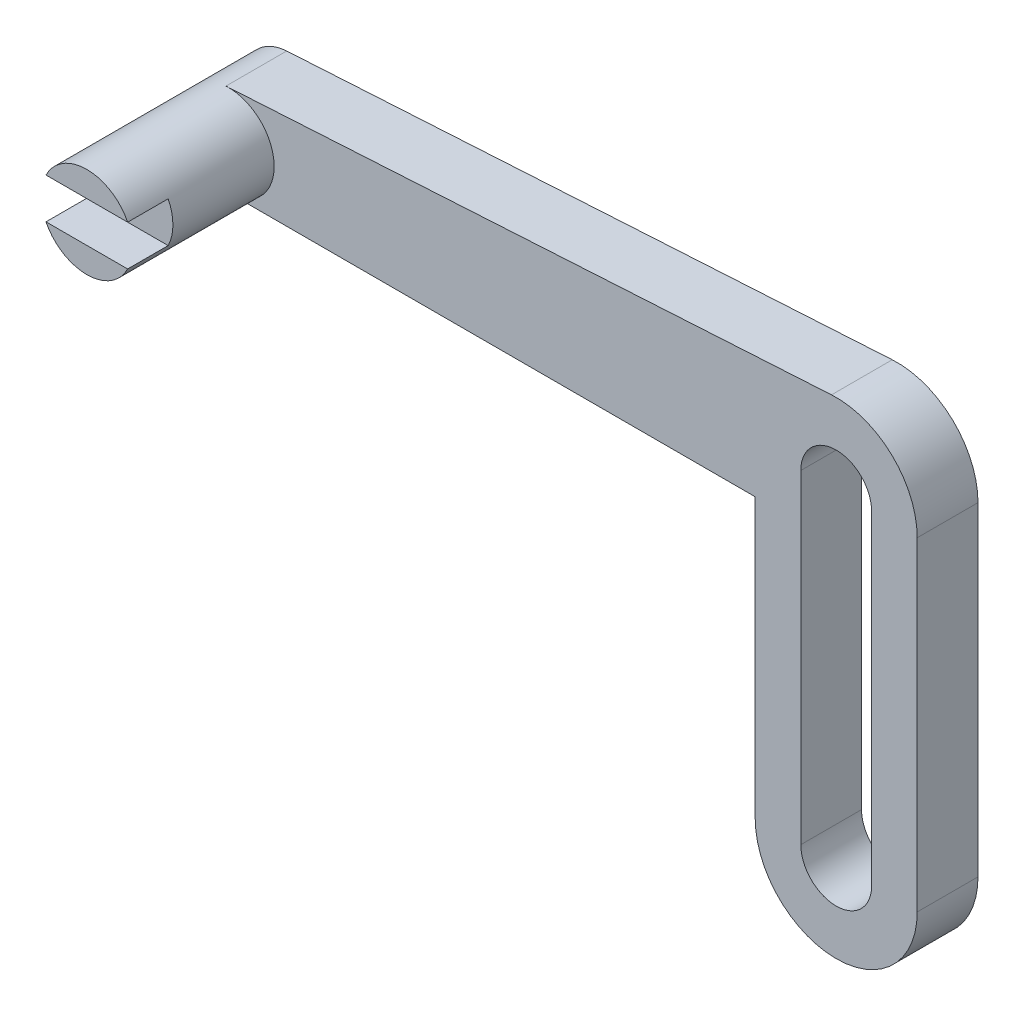
ISO-10303-21;
HEADER;
FILE_DESCRIPTION(('STEP AP214'),'2;1');
FILE_NAME('part.step','',(''),(''),'','','');
FILE_SCHEMA(('AUTOMOTIVE_DESIGN { 1 0 10303 214 1 1 1 1 }'));
ENDSEC;
DATA;
#1=APPLICATION_CONTEXT('core data for automotive mechanical design processes');
#2=APPLICATION_PROTOCOL_DEFINITION('international standard','automotive_design',2000,#1);
#3=PRODUCT_CONTEXT('',#1,'mechanical');
#4=PRODUCT('Part','Part','',(#3));
#5=PRODUCT_RELATED_PRODUCT_CATEGORY('part','',(#4));
#6=PRODUCT_DEFINITION_FORMATION('','',#4);
#7=PRODUCT_DEFINITION_CONTEXT('part definition',#1,'design');
#8=PRODUCT_DEFINITION('design','',#6,#7);
#9=PRODUCT_DEFINITION_SHAPE('','',#8);
#10=(LENGTH_UNIT() NAMED_UNIT(*) SI_UNIT(.MILLI.,.METRE.));
#11=(NAMED_UNIT(*) PLANE_ANGLE_UNIT() SI_UNIT($,.RADIAN.));
#12=(NAMED_UNIT(*) SI_UNIT($,.STERADIAN.) SOLID_ANGLE_UNIT());
#13=UNCERTAINTY_MEASURE_WITH_UNIT(LENGTH_MEASURE(1.E-05),#10,'distance_accuracy_value','');
#14=(GEOMETRIC_REPRESENTATION_CONTEXT(3) GLOBAL_UNCERTAINTY_ASSIGNED_CONTEXT((#13)) GLOBAL_UNIT_ASSIGNED_CONTEXT((#10,
#11,#12)) REPRESENTATION_CONTEXT('',''));
#15=CARTESIAN_POINT('',(0.,0.,0.));
#16=DIRECTION('',(0.,0.,1.));
#17=DIRECTION('',(1.,0.,0.));
#18=AXIS2_PLACEMENT_3D('',#15,#16,#17);
#19=CARTESIAN_POINT('',(0.,0.,10.));
#20=DIRECTION('',(0.,0.,1.));
#21=DIRECTION('',(1.,0.,0.));
#22=AXIS2_PLACEMENT_3D('',#19,#20,#21);
#23=PLANE('',#22);
#24=DIRECTION('',(-1.,0.,0.));
#25=VECTOR('',#24,1.);
#26=CARTESIAN_POINT('',(0.,1.,10.));
#27=LINE('',#26,#25);
#28=CARTESIAN_POINT('',(2.01556443707464,1.,10.));
#29=VERTEX_POINT('',#28);
#30=CARTESIAN_POINT('',(-2.01556443707464,1.,10.));
#31=VERTEX_POINT('',#30);
#32=EDGE_CURVE('E162',#29,#31,#27,.T.);
#33=ORIENTED_EDGE('',*,*,#32,.F.);
#34=CARTESIAN_POINT('',(0.,0.,10.));
#35=DIRECTION('',(0.,0.,1.));
#36=DIRECTION('',(1.,0.,0.));
#37=AXIS2_PLACEMENT_3D('',#34,#35,#36);
#38=CIRCLE('',#37,2.25);
#39=EDGE_CURVE('E176',#29,#31,#38,.T.);
#40=ORIENTED_EDGE('',*,*,#39,.T.);
#41=EDGE_LOOP('',(#33,#40));
#42=FACE_BOUND('',#41,.T.);
#43=ADVANCED_FACE('F41',(#42),#23,.T.);
#44=CARTESIAN_POINT('',(0.,0.,3.));
#45=DIRECTION('',(0.,0.,-1.));
#46=DIRECTION('',(-1.,0.,0.));
#47=AXIS2_PLACEMENT_3D('',#44,#45,#46);
#48=CYLINDRICAL_SURFACE('',#47,2.25);
#49=ORIENTED_EDGE('',*,*,#39,.F.);
#50=DIRECTION('',(0.,0.,-1.));
#51=VECTOR('',#50,1.);
#52=CARTESIAN_POINT('',(2.01556443707464,1.,3.));
#53=LINE('',#52,#51);
#54=CARTESIAN_POINT('',(2.01556443707464,1.,8.));
#55=VERTEX_POINT('',#54);
#56=EDGE_CURVE('E177',#29,#55,#53,.T.);
#57=ORIENTED_EDGE('',*,*,#56,.T.);
#58=CARTESIAN_POINT('',(0.,0.,8.));
#59=DIRECTION('',(0.,0.,-1.));
#60=DIRECTION('',(-1.,0.,0.));
#61=AXIS2_PLACEMENT_3D('',#58,#59,#60);
#62=CIRCLE('',#61,2.25);
#63=CARTESIAN_POINT('',(2.01556443707464,-1.,8.));
#64=VERTEX_POINT('',#63);
#65=EDGE_CURVE('E172',#55,#64,#62,.T.);
#66=ORIENTED_EDGE('',*,*,#65,.T.);
#67=DIRECTION('',(0.,0.,-1.));
#68=VECTOR('',#67,1.);
#69=CARTESIAN_POINT('',(2.01556443707464,-1.,3.));
#70=LINE('',#69,#68);
#71=CARTESIAN_POINT('',(2.01556443707464,-1.,10.));
#72=VERTEX_POINT('',#71);
#73=EDGE_CURVE('E155',#64,#72,#70,.F.);
#74=ORIENTED_EDGE('',*,*,#73,.T.);
#75=CARTESIAN_POINT('',(-2.01556443707464,-1.,10.));
#76=VERTEX_POINT('',#75);
#77=EDGE_CURVE('E170',#76,#72,#38,.T.);
#78=ORIENTED_EDGE('',*,*,#77,.F.);
#79=DIRECTION('',(0.,0.,-1.));
#80=VECTOR('',#79,1.);
#81=CARTESIAN_POINT('',(-2.01556443707464,-1.,3.));
#82=LINE('',#81,#80);
#83=CARTESIAN_POINT('',(-2.01556443707464,-1.,8.));
#84=VERTEX_POINT('',#83);
#85=EDGE_CURVE('E158',#76,#84,#82,.T.);
#86=ORIENTED_EDGE('',*,*,#85,.T.);
#87=CARTESIAN_POINT('',(-2.01556443707464,1.,8.));
#88=VERTEX_POINT('',#87);
#89=EDGE_CURVE('E259',#84,#88,#62,.T.);
#90=ORIENTED_EDGE('',*,*,#89,.T.);
#91=DIRECTION('',(0.,0.,-1.));
#92=VECTOR('',#91,1.);
#93=CARTESIAN_POINT('',(-2.01556443707464,1.,3.));
#94=LINE('',#93,#92);
#95=EDGE_CURVE('E181',#88,#31,#94,.F.);
#96=ORIENTED_EDGE('',*,*,#95,.T.);
#97=EDGE_LOOP('',(#49,#57,#66,#74,#78,#86,#90,#96));
#98=FACE_BOUND('',#97,.T.);
#99=CARTESIAN_POINT('',(0.,0.,0.));
#100=DIRECTION('',(0.,0.,1.));
#101=DIRECTION('',(1.,0.,0.));
#102=AXIS2_PLACEMENT_3D('',#99,#100,#101);
#103=CIRCLE('',#102,2.25);
#104=CARTESIAN_POINT('',(-0.13125,2.24616861288283,0.));
#105=VERTEX_POINT('',#104);
#106=CARTESIAN_POINT('',(0.,-2.25,0.));
#107=VERTEX_POINT('',#106);
#108=EDGE_CURVE('E224',#105,#107,#103,.T.);
#109=ORIENTED_EDGE('',*,*,#108,.T.);
#110=DIRECTION('',(0.,0.,-1.));
#111=VECTOR('',#110,1.);
#112=CARTESIAN_POINT('',(0.,-2.25,3.));
#113=LINE('',#112,#111);
#114=CARTESIAN_POINT('',(0.,-2.25,3.));
#115=VERTEX_POINT('',#114);
#116=EDGE_CURVE('E163',#115,#107,#113,.T.);
#117=ORIENTED_EDGE('',*,*,#116,.F.);
#118=CARTESIAN_POINT('',(0.,0.,3.));
#119=DIRECTION('',(0.,0.,1.));
#120=DIRECTION('',(1.,0.,0.));
#121=AXIS2_PLACEMENT_3D('',#118,#119,#120);
#122=CIRCLE('',#121,2.25);
#123=CARTESIAN_POINT('',(-0.13125,2.24616861288284,3.));
#124=VERTEX_POINT('',#123);
#125=EDGE_CURVE('E180',#124,#115,#122,.F.);
#126=ORIENTED_EDGE('',*,*,#125,.F.);
#127=DIRECTION('',(0.,0.,-1.));
#128=VECTOR('',#127,1.);
#129=CARTESIAN_POINT('',(-0.13125,2.24616861288283,3.));
#130=LINE('',#129,#128);
#131=EDGE_CURVE('E240',#124,#105,#130,.T.);
#132=ORIENTED_EDGE('',*,*,#131,.T.);
#133=EDGE_LOOP('',(#109,#117,#126,#132));
#134=FACE_BOUND('',#133,.T.);
#135=ADVANCED_FACE('F168',(#98,#134),#48,.T.);
#136=CARTESIAN_POINT('',(0.,-2.25,3.));
#137=DIRECTION('',(0.,1.,0.));
#138=DIRECTION('',(-1.,0.,0.));
#139=AXIS2_PLACEMENT_3D('',#136,#137,#138);
#140=PLANE('',#139);
#141=DIRECTION('',(1.,0.,0.));
#142=VECTOR('',#141,1.);
#143=CARTESIAN_POINT('',(0.,-2.25,0.));
#144=LINE('',#143,#142);
#145=CARTESIAN_POINT('',(26.,-2.25,0.));
#146=VERTEX_POINT('',#145);
#147=EDGE_CURVE('E227',#107,#146,#144,.T.);
#148=ORIENTED_EDGE('',*,*,#147,.T.);
#149=DIRECTION('',(0.,0.,-1.));
#150=VECTOR('',#149,1.);
#151=CARTESIAN_POINT('',(26.,-2.25,3.));
#152=LINE('',#151,#150);
#153=CARTESIAN_POINT('',(26.,-2.25,3.));
#154=VERTEX_POINT('',#153);
#155=EDGE_CURVE('E247',#154,#146,#152,.T.);
#156=ORIENTED_EDGE('',*,*,#155,.F.);
#157=DIRECTION('',(1.,0.,0.));
#158=VECTOR('',#157,1.);
#159=CARTESIAN_POINT('',(0.,-2.25,3.));
#160=LINE('',#159,#158);
#161=EDGE_CURVE('E200',#115,#154,#160,.T.);
#162=ORIENTED_EDGE('',*,*,#161,.F.);
#163=ORIENTED_EDGE('',*,*,#116,.T.);
#164=EDGE_LOOP('',(#148,#156,#162,#163));
#165=FACE_BOUND('',#164,.T.);
#166=ADVANCED_FACE('F282',(#165),#140,.F.);
#167=CARTESIAN_POINT('',(26.,0.,3.));
#168=DIRECTION('',(-1.,0.,0.));
#169=DIRECTION('',(0.,0.,1.));
#170=AXIS2_PLACEMENT_3D('',#167,#168,#169);
#171=PLANE('',#170);
#172=DIRECTION('',(0.,1.,0.));
#173=VECTOR('',#172,1.);
#174=CARTESIAN_POINT('',(26.,0.,0.));
#175=LINE('',#174,#173);
#176=CARTESIAN_POINT('',(26.,-16.,0.));
#177=VERTEX_POINT('',#176);
#178=EDGE_CURVE('E230',#177,#146,#175,.T.);
#179=ORIENTED_EDGE('',*,*,#178,.F.);
#180=DIRECTION('',(0.,0.,-1.));
#181=VECTOR('',#180,1.);
#182=CARTESIAN_POINT('',(26.,-16.,3.));
#183=LINE('',#182,#181);
#184=CARTESIAN_POINT('',(26.,-16.,3.));
#185=VERTEX_POINT('',#184);
#186=EDGE_CURVE('E266',#177,#185,#183,.F.);
#187=ORIENTED_EDGE('',*,*,#186,.T.);
#188=DIRECTION('',(0.,1.,0.));
#189=VECTOR('',#188,1.);
#190=CARTESIAN_POINT('',(26.,0.,3.));
#191=LINE('',#190,#189);
#192=EDGE_CURVE('E203',#185,#154,#191,.T.);
#193=ORIENTED_EDGE('',*,*,#192,.T.);
#194=ORIENTED_EDGE('',*,*,#155,.T.);
#195=EDGE_LOOP('',(#179,#187,#193,#194));
#196=FACE_BOUND('',#195,.T.);
#197=ADVANCED_FACE('F273',(#196),#171,.T.);
#198=CARTESIAN_POINT('',(34.,0.,3.));
#199=DIRECTION('',(1.,0.,0.));
#200=DIRECTION('',(0.,1.,0.));
#201=AXIS2_PLACEMENT_3D('',#198,#199,#200);
#202=PLANE('',#201);
#203=DIRECTION('',(0.,-1.,0.));
#204=VECTOR('',#203,1.);
#205=CARTESIAN_POINT('',(34.,0.,3.));
#206=LINE('',#205,#204);
#207=CARTESIAN_POINT('',(34.,0.,3.));
#208=VERTEX_POINT('',#207);
#209=CARTESIAN_POINT('',(34.,-16.,3.));
#210=VERTEX_POINT('',#209);
#211=EDGE_CURVE('E205',#208,#210,#206,.T.);
#212=ORIENTED_EDGE('',*,*,#211,.T.);
#213=DIRECTION('',(0.,0.,-1.));
#214=VECTOR('',#213,1.);
#215=CARTESIAN_POINT('',(34.,-16.,3.));
#216=LINE('',#215,#214);
#217=CARTESIAN_POINT('',(34.,-16.,0.));
#218=VERTEX_POINT('',#217);
#219=EDGE_CURVE('E11',#210,#218,#216,.T.);
#220=ORIENTED_EDGE('',*,*,#219,.T.);
#221=DIRECTION('',(0.,-1.,0.));
#222=VECTOR('',#221,1.);
#223=CARTESIAN_POINT('',(34.,0.,0.));
#224=LINE('',#223,#222);
#225=CARTESIAN_POINT('',(34.,0.,0.));
#226=VERTEX_POINT('',#225);
#227=EDGE_CURVE('E232',#226,#218,#224,.T.);
#228=ORIENTED_EDGE('',*,*,#227,.F.);
#229=DIRECTION('',(0.,0.,-1.));
#230=VECTOR('',#229,1.);
#231=CARTESIAN_POINT('',(34.,0.,3.));
#232=LINE('',#231,#230);
#233=EDGE_CURVE('E245',#208,#226,#232,.T.);
#234=ORIENTED_EDGE('',*,*,#233,.F.);
#235=EDGE_LOOP('',(#212,#220,#228,#234));
#236=FACE_BOUND('',#235,.T.);
#237=ADVANCED_FACE('F335',(#236),#202,.T.);
#238=CARTESIAN_POINT('',(30.,0.,3.));
#239=DIRECTION('',(0.,0.,-1.));
#240=DIRECTION('',(-1.,0.,0.));
#241=AXIS2_PLACEMENT_3D('',#238,#239,#240);
#242=CYLINDRICAL_SURFACE('',#241,4.);
#243=CARTESIAN_POINT('',(30.,0.,0.));
#244=DIRECTION('',(0.,0.,1.));
#245=DIRECTION('',(1.,0.,0.));
#246=AXIS2_PLACEMENT_3D('',#243,#244,#245);
#247=CIRCLE('',#246,4.);
#248=CARTESIAN_POINT('',(29.7666666666667,3.99318864512504,0.));
#249=VERTEX_POINT('',#248);
#250=EDGE_CURVE('E235',#226,#249,#247,.T.);
#251=ORIENTED_EDGE('',*,*,#250,.T.);
#252=DIRECTION('',(0.,0.,-1.));
#253=VECTOR('',#252,1.);
#254=CARTESIAN_POINT('',(29.7666666666667,3.99318864512504,3.));
#255=LINE('',#254,#253);
#256=CARTESIAN_POINT('',(29.7666666666667,3.99318864512504,3.));
#257=VERTEX_POINT('',#256);
#258=EDGE_CURVE('E242',#257,#249,#255,.T.);
#259=ORIENTED_EDGE('',*,*,#258,.F.);
#260=CARTESIAN_POINT('',(30.,0.,3.));
#261=DIRECTION('',(0.,0.,1.));
#262=DIRECTION('',(1.,0.,0.));
#263=AXIS2_PLACEMENT_3D('',#260,#261,#262);
#264=CIRCLE('',#263,4.);
#265=EDGE_CURVE('E207',#208,#257,#264,.T.);
#266=ORIENTED_EDGE('',*,*,#265,.F.);
#267=ORIENTED_EDGE('',*,*,#233,.T.);
#268=EDGE_LOOP('',(#251,#259,#266,#267));
#269=FACE_BOUND('',#268,.T.);
#270=ADVANCED_FACE('F331',(#269),#242,.T.);
#271=CARTESIAN_POINT('',(28.25,0.,3.));
#272=DIRECTION('',(1.,0.,0.));
#273=DIRECTION('',(0.,1.,0.));
#274=AXIS2_PLACEMENT_3D('',#271,#272,#273);
#275=PLANE('',#274);
#276=DIRECTION('',(0.,-1.,0.));
#277=VECTOR('',#276,1.);
#278=CARTESIAN_POINT('',(28.25,0.,0.));
#279=LINE('',#278,#277);
#280=CARTESIAN_POINT('',(28.25,0.,0.));
#281=VERTEX_POINT('',#280);
#282=CARTESIAN_POINT('',(28.25,-16.,0.));
#283=VERTEX_POINT('',#282);
#284=EDGE_CURVE('E186',#281,#283,#279,.T.);
#285=ORIENTED_EDGE('',*,*,#284,.F.);
#286=DIRECTION('',(0.,0.,-1.));
#287=VECTOR('',#286,1.);
#288=CARTESIAN_POINT('',(28.25,0.,3.));
#289=LINE('',#288,#287);
#290=CARTESIAN_POINT('',(28.25,0.,3.));
#291=VERTEX_POINT('',#290);
#292=EDGE_CURVE('E243',#291,#281,#289,.T.);
#293=ORIENTED_EDGE('',*,*,#292,.F.);
#294=DIRECTION('',(0.,-1.,0.));
#295=VECTOR('',#294,1.);
#296=CARTESIAN_POINT('',(28.25,0.,3.));
#297=LINE('',#296,#295);
#298=CARTESIAN_POINT('',(28.25,-16.,3.));
#299=VERTEX_POINT('',#298);
#300=EDGE_CURVE('E187',#291,#299,#297,.T.);
#301=ORIENTED_EDGE('',*,*,#300,.T.);
#302=DIRECTION('',(0.,0.,-1.));
#303=VECTOR('',#302,1.);
#304=CARTESIAN_POINT('',(28.25,-16.,3.));
#305=LINE('',#304,#303);
#306=EDGE_CURVE('E212',#299,#283,#305,.T.);
#307=ORIENTED_EDGE('',*,*,#306,.T.);
#308=EDGE_LOOP('',(#285,#293,#301,#307));
#309=FACE_BOUND('',#308,.T.);
#310=ADVANCED_FACE('F334',(#309),#275,.T.);
#311=CARTESIAN_POINT('',(30.,0.,3.));
#312=DIRECTION('',(0.,0.,-1.));
#313=DIRECTION('',(-1.,0.,0.));
#314=AXIS2_PLACEMENT_3D('',#311,#312,#313);
#315=CYLINDRICAL_SURFACE('',#314,1.75);
#316=CARTESIAN_POINT('',(30.,0.,0.));
#317=DIRECTION('',(0.,0.,1.));
#318=DIRECTION('',(1.,0.,0.));
#319=AXIS2_PLACEMENT_3D('',#316,#317,#318);
#320=CIRCLE('',#319,1.75);
#321=CARTESIAN_POINT('',(31.75,0.,0.));
#322=VERTEX_POINT('',#321);
#323=EDGE_CURVE('E215',#322,#281,#320,.T.);
#324=ORIENTED_EDGE('',*,*,#323,.F.);
#325=DIRECTION('',(0.,0.,-1.));
#326=VECTOR('',#325,1.);
#327=CARTESIAN_POINT('',(31.75,0.,3.));
#328=LINE('',#327,#326);
#329=CARTESIAN_POINT('',(31.75,0.,3.));
#330=VERTEX_POINT('',#329);
#331=EDGE_CURVE('E255',#330,#322,#328,.T.);
#332=ORIENTED_EDGE('',*,*,#331,.F.);
#333=CARTESIAN_POINT('',(30.,0.,3.));
#334=DIRECTION('',(0.,0.,1.));
#335=DIRECTION('',(1.,0.,0.));
#336=AXIS2_PLACEMENT_3D('',#333,#334,#335);
#337=CIRCLE('',#336,1.75);
#338=EDGE_CURVE('E190',#330,#291,#337,.T.);
#339=ORIENTED_EDGE('',*,*,#338,.T.);
#340=ORIENTED_EDGE('',*,*,#292,.T.);
#341=EDGE_LOOP('',(#324,#332,#339,#340));
#342=FACE_BOUND('',#341,.T.);
#343=ADVANCED_FACE('F350',(#342),#315,.F.);
#344=CARTESIAN_POINT('',(31.75,0.,3.));
#345=DIRECTION('',(-1.,0.,0.));
#346=DIRECTION('',(0.,0.,1.));
#347=AXIS2_PLACEMENT_3D('',#344,#345,#346);
#348=PLANE('',#347);
#349=DIRECTION('',(0.,1.,0.));
#350=VECTOR('',#349,1.);
#351=CARTESIAN_POINT('',(31.75,0.,0.));
#352=LINE('',#351,#350);
#353=CARTESIAN_POINT('',(31.75,-16.,0.));
#354=VERTEX_POINT('',#353);
#355=EDGE_CURVE('E218',#354,#322,#352,.T.);
#356=ORIENTED_EDGE('',*,*,#355,.F.);
#357=DIRECTION('',(0.,0.,-1.));
#358=VECTOR('',#357,1.);
#359=CARTESIAN_POINT('',(31.75,-16.,3.));
#360=LINE('',#359,#358);
#361=CARTESIAN_POINT('',(31.75,-16.,3.));
#362=VERTEX_POINT('',#361);
#363=EDGE_CURVE('E253',#362,#354,#360,.T.);
#364=ORIENTED_EDGE('',*,*,#363,.F.);
#365=DIRECTION('',(0.,1.,0.));
#366=VECTOR('',#365,1.);
#367=CARTESIAN_POINT('',(31.75,0.,3.));
#368=LINE('',#367,#366);
#369=EDGE_CURVE('E194',#362,#330,#368,.T.);
#370=ORIENTED_EDGE('',*,*,#369,.T.);
#371=ORIENTED_EDGE('',*,*,#331,.T.);
#372=EDGE_LOOP('',(#356,#364,#370,#371));
#373=FACE_BOUND('',#372,.T.);
#374=ADVANCED_FACE('F346',(#373),#348,.T.);
#375=CARTESIAN_POINT('',(30.,-16.,3.));
#376=DIRECTION('',(0.,0.,-1.));
#377=DIRECTION('',(-1.,0.,0.));
#378=AXIS2_PLACEMENT_3D('',#375,#376,#377);
#379=CYLINDRICAL_SURFACE('',#378,1.75000000000001);
#380=CARTESIAN_POINT('',(30.,-16.,0.));
#381=DIRECTION('',(0.,0.,1.));
#382=DIRECTION('',(1.,0.,0.));
#383=AXIS2_PLACEMENT_3D('',#380,#381,#382);
#384=CIRCLE('',#383,1.75000000000001);
#385=EDGE_CURVE('E221',#283,#354,#384,.T.);
#386=ORIENTED_EDGE('',*,*,#385,.F.);
#387=ORIENTED_EDGE('',*,*,#306,.F.);
#388=CARTESIAN_POINT('',(30.,-16.,3.));
#389=DIRECTION('',(0.,0.,1.));
#390=DIRECTION('',(1.,0.,0.));
#391=AXIS2_PLACEMENT_3D('',#388,#389,#390);
#392=CIRCLE('',#391,1.75000000000001);
#393=EDGE_CURVE('E197',#299,#362,#392,.T.);
#394=ORIENTED_EDGE('',*,*,#393,.T.);
#395=ORIENTED_EDGE('',*,*,#363,.T.);
#396=EDGE_LOOP('',(#386,#387,#394,#395));
#397=FACE_BOUND('',#396,.T.);
#398=ADVANCED_FACE('F329',(#397),#379,.F.);
#399=CARTESIAN_POINT('',(-0.13125,2.24616861288284,3.));
#400=DIRECTION('',(-0.0583333333333333,0.99829716128126,0.));
#401=DIRECTION('',(-0.99829716128126,-0.0583333333333333,0.));
#402=AXIS2_PLACEMENT_3D('',#399,#400,#401);
#403=PLANE('',#402);
#404=DIRECTION('',(0.99829716128126,0.0583333333333333,0.));
#405=VECTOR('',#404,1.);
#406=CARTESIAN_POINT('',(-0.13125,2.24616861288284,0.));
#407=LINE('',#406,#405);
#408=EDGE_CURVE('E191',#105,#249,#407,.T.);
#409=ORIENTED_EDGE('',*,*,#408,.F.);
#410=ORIENTED_EDGE('',*,*,#131,.F.);
#411=DIRECTION('',(0.99829716128126,0.0583333333333333,0.));
#412=VECTOR('',#411,1.);
#413=CARTESIAN_POINT('',(-0.13125,2.24616861288284,3.));
#414=LINE('',#413,#412);
#415=EDGE_CURVE('E209',#124,#257,#414,.T.);
#416=ORIENTED_EDGE('',*,*,#415,.T.);
#417=ORIENTED_EDGE('',*,*,#258,.T.);
#418=EDGE_LOOP('',(#409,#410,#416,#417));
#419=FACE_BOUND('',#418,.T.);
#420=ADVANCED_FACE('F323',(#419),#403,.T.);
#421=CARTESIAN_POINT('',(0.,0.,3.));
#422=DIRECTION('',(0.,0.,1.));
#423=DIRECTION('',(1.,0.,0.));
#424=AXIS2_PLACEMENT_3D('',#421,#422,#423);
#425=PLANE('',#424);
#426=ORIENTED_EDGE('',*,*,#300,.F.);
#427=ORIENTED_EDGE('',*,*,#338,.F.);
#428=ORIENTED_EDGE('',*,*,#369,.F.);
#429=ORIENTED_EDGE('',*,*,#393,.F.);
#430=EDGE_LOOP('',(#426,#427,#428,#429));
#431=FACE_BOUND('',#430,.T.);
#432=ORIENTED_EDGE('',*,*,#192,.F.);
#433=CARTESIAN_POINT('',(30.,-16.,3.));
#434=DIRECTION('',(0.,0.,1.));
#435=DIRECTION('',(1.,0.,0.));
#436=AXIS2_PLACEMENT_3D('',#433,#434,#435);
#437=CIRCLE('',#436,4.);
#438=CARTESIAN_POINT('',(30.,-20.,3.));
#439=VERTEX_POINT('',#438);
#440=EDGE_CURVE('E50',#185,#439,#437,.T.);
#441=ORIENTED_EDGE('',*,*,#440,.T.);
#442=CARTESIAN_POINT('',(30.,-16.,3.));
#443=DIRECTION('',(0.,0.,1.));
#444=DIRECTION('',(1.,0.,0.));
#445=AXIS2_PLACEMENT_3D('',#442,#443,#444);
#446=CIRCLE('',#445,4.);
#447=EDGE_CURVE('E57',#439,#210,#446,.T.);
#448=ORIENTED_EDGE('',*,*,#447,.T.);
#449=ORIENTED_EDGE('',*,*,#211,.F.);
#450=ORIENTED_EDGE('',*,*,#265,.T.);
#451=ORIENTED_EDGE('',*,*,#415,.F.);
#452=ORIENTED_EDGE('',*,*,#125,.T.);
#453=ORIENTED_EDGE('',*,*,#161,.T.);
#454=EDGE_LOOP('',(#432,#441,#448,#449,#450,#451,#452,#453));
#455=FACE_BOUND('',#454,.T.);
#456=ADVANCED_FACE('F276',(#431,#455),#425,.T.);
#457=CARTESIAN_POINT('',(0.,0.,0.));
#458=DIRECTION('',(0.,0.,1.));
#459=DIRECTION('',(1.,0.,0.));
#460=AXIS2_PLACEMENT_3D('',#457,#458,#459);
#461=PLANE('',#460);
#462=CARTESIAN_POINT('',(30.,-16.,0.));
#463=DIRECTION('',(0.,0.,1.));
#464=DIRECTION('',(1.,0.,0.));
#465=AXIS2_PLACEMENT_3D('',#462,#463,#464);
#466=CIRCLE('',#465,4.);
#467=CARTESIAN_POINT('',(30.,-20.,0.));
#468=VERTEX_POINT('',#467);
#469=EDGE_CURVE('E262',#218,#468,#466,.F.);
#470=ORIENTED_EDGE('',*,*,#469,.T.);
#471=CARTESIAN_POINT('',(30.,-16.,0.));
#472=DIRECTION('',(0.,0.,1.));
#473=DIRECTION('',(1.,0.,0.));
#474=AXIS2_PLACEMENT_3D('',#471,#472,#473);
#475=CIRCLE('',#474,4.);
#476=EDGE_CURVE('E264',#468,#177,#475,.F.);
#477=ORIENTED_EDGE('',*,*,#476,.T.);
#478=ORIENTED_EDGE('',*,*,#178,.T.);
#479=ORIENTED_EDGE('',*,*,#147,.F.);
#480=ORIENTED_EDGE('',*,*,#108,.F.);
#481=ORIENTED_EDGE('',*,*,#408,.T.);
#482=ORIENTED_EDGE('',*,*,#250,.F.);
#483=ORIENTED_EDGE('',*,*,#227,.T.);
#484=EDGE_LOOP('',(#470,#477,#478,#479,#480,#481,#482,#483));
#485=FACE_BOUND('',#484,.T.);
#486=ORIENTED_EDGE('',*,*,#284,.T.);
#487=ORIENTED_EDGE('',*,*,#385,.T.);
#488=ORIENTED_EDGE('',*,*,#355,.T.);
#489=ORIENTED_EDGE('',*,*,#323,.T.);
#490=EDGE_LOOP('',(#486,#487,#488,#489));
#491=FACE_BOUND('',#490,.T.);
#492=ADVANCED_FACE('F285',(#485,#491),#461,.F.);
#493=DIRECTION('',(1.,0.,0.));
#494=VECTOR('',#493,1.);
#495=CARTESIAN_POINT('',(0.,-1.,10.));
#496=LINE('',#495,#494);
#497=EDGE_CURVE('E151',#76,#72,#496,.T.);
#498=ORIENTED_EDGE('',*,*,#497,.F.);
#499=ORIENTED_EDGE('',*,*,#77,.T.);
#500=EDGE_LOOP('',(#498,#499));
#501=FACE_BOUND('',#500,.T.);
#502=ADVANCED_FACE('F175',(#501),#23,.T.);
#503=CARTESIAN_POINT('',(0.,0.,8.));
#504=DIRECTION('',(0.,0.,-1.));
#505=DIRECTION('',(-1.,0.,0.));
#506=AXIS2_PLACEMENT_3D('',#503,#504,#505);
#507=PLANE('',#506);
#508=DIRECTION('',(-1.,0.,0.));
#509=VECTOR('',#508,1.);
#510=CARTESIAN_POINT('',(2.5,1.,8.));
#511=LINE('',#510,#509);
#512=EDGE_CURVE('E173',#55,#88,#511,.T.);
#513=ORIENTED_EDGE('',*,*,#512,.T.);
#514=ORIENTED_EDGE('',*,*,#89,.F.);
#515=DIRECTION('',(1.,0.,0.));
#516=VECTOR('',#515,1.);
#517=CARTESIAN_POINT('',(2.5,-1.,8.));
#518=LINE('',#517,#516);
#519=EDGE_CURVE('E293',#84,#64,#518,.T.);
#520=ORIENTED_EDGE('',*,*,#519,.T.);
#521=ORIENTED_EDGE('',*,*,#65,.F.);
#522=EDGE_LOOP('',(#513,#514,#520,#521));
#523=FACE_BOUND('',#522,.T.);
#524=ADVANCED_FACE('F305',(#523),#507,.F.);
#525=CARTESIAN_POINT('',(2.5,1.,8.));
#526=DIRECTION('',(0.,1.,0.));
#527=DIRECTION('',(-1.,0.,0.));
#528=AXIS2_PLACEMENT_3D('',#525,#526,#527);
#529=PLANE('',#528);
#530=ORIENTED_EDGE('',*,*,#32,.T.);
#531=ORIENTED_EDGE('',*,*,#95,.F.);
#532=ORIENTED_EDGE('',*,*,#512,.F.);
#533=ORIENTED_EDGE('',*,*,#56,.F.);
#534=EDGE_LOOP('',(#530,#531,#532,#533));
#535=FACE_BOUND('',#534,.T.);
#536=ADVANCED_FACE('F304',(#535),#529,.F.);
#537=CARTESIAN_POINT('',(2.5,-1.,8.));
#538=DIRECTION('',(0.,-1.,0.));
#539=DIRECTION('',(1.,0.,0.));
#540=AXIS2_PLACEMENT_3D('',#537,#538,#539);
#541=PLANE('',#540);
#542=ORIENTED_EDGE('',*,*,#497,.T.);
#543=ORIENTED_EDGE('',*,*,#73,.F.);
#544=ORIENTED_EDGE('',*,*,#519,.F.);
#545=ORIENTED_EDGE('',*,*,#85,.F.);
#546=EDGE_LOOP('',(#542,#543,#544,#545));
#547=FACE_BOUND('',#546,.T.);
#548=ADVANCED_FACE('F153',(#547),#541,.F.);
#549=CARTESIAN_POINT('',(30.,-16.,3.));
#550=DIRECTION('',(0.,0.,-1.));
#551=DIRECTION('',(-1.,0.,0.));
#552=AXIS2_PLACEMENT_3D('',#549,#550,#551);
#553=CYLINDRICAL_SURFACE('',#552,4.);
#554=ORIENTED_EDGE('',*,*,#219,.F.);
#555=ORIENTED_EDGE('',*,*,#447,.F.);
#556=DIRECTION('',(0.,0.,-1.));
#557=VECTOR('',#556,1.);
#558=CARTESIAN_POINT('',(30.,-20.,3.));
#559=LINE('',#558,#557);
#560=EDGE_CURVE('E45',#468,#439,#559,.F.);
#561=ORIENTED_EDGE('',*,*,#560,.F.);
#562=ORIENTED_EDGE('',*,*,#469,.F.);
#563=EDGE_LOOP('',(#554,#555,#561,#562));
#564=FACE_BOUND('',#563,.T.);
#565=ADVANCED_FACE('F43',(#564),#553,.T.);
#566=CARTESIAN_POINT('',(30.,-16.,3.));
#567=DIRECTION('',(0.,0.,-1.));
#568=DIRECTION('',(-1.,0.,0.));
#569=AXIS2_PLACEMENT_3D('',#566,#567,#568);
#570=CYLINDRICAL_SURFACE('',#569,4.);
#571=ORIENTED_EDGE('',*,*,#440,.F.);
#572=ORIENTED_EDGE('',*,*,#186,.F.);
#573=ORIENTED_EDGE('',*,*,#476,.F.);
#574=ORIENTED_EDGE('',*,*,#560,.T.);
#575=EDGE_LOOP('',(#571,#572,#573,#574));
#576=FACE_BOUND('',#575,.T.);
#577=ADVANCED_FACE('F291',(#576),#570,.T.);
#578=CLOSED_SHELL('',(#43,#135,#166,#197,#237,#270,#310,#343,#374,#398,#420,#456,#492,#502,#524,
#536,#548,#565,#577));
#579=MANIFOLD_SOLID_BREP('B2',#578);
#580=ADVANCED_BREP_SHAPE_REPRESENTATION('',(#18,#579),#14);
#581=SHAPE_DEFINITION_REPRESENTATION(#9,#580);
ENDSEC;
END-ISO-10303-21;
